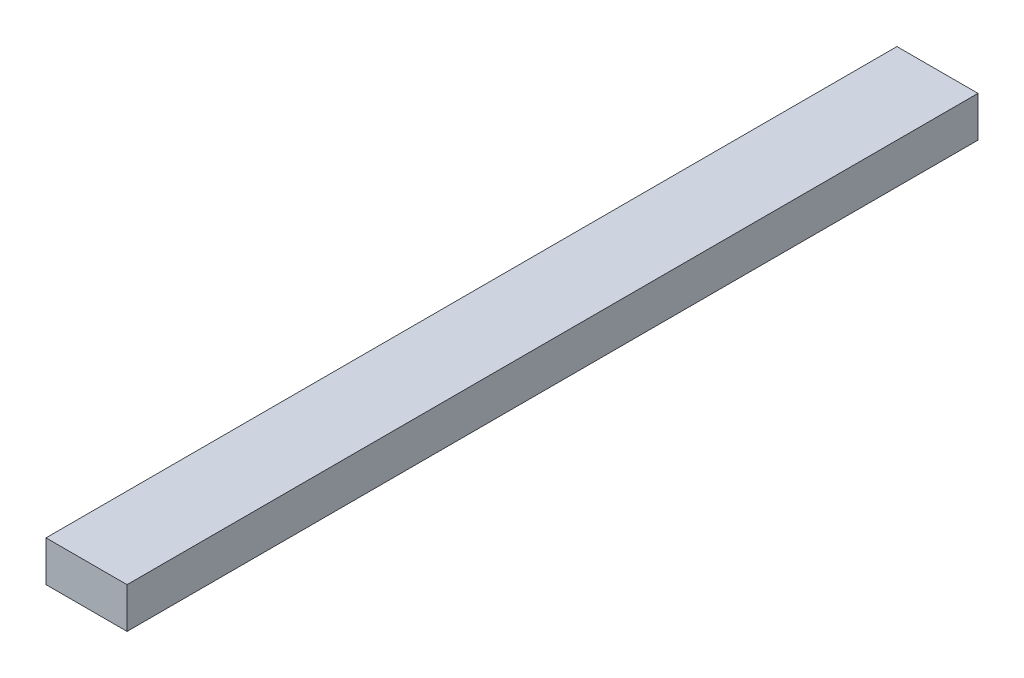
ISO-10303-21;
HEADER;
FILE_DESCRIPTION(('STEP AP214'),'2;1');
FILE_NAME('part.step','',(''),(''),'','','');
FILE_SCHEMA(('AUTOMOTIVE_DESIGN { 1 0 10303 214 1 1 1 1 }'));
ENDSEC;
DATA;
#1=APPLICATION_CONTEXT('core data for automotive mechanical design processes');
#2=APPLICATION_PROTOCOL_DEFINITION('international standard','automotive_design',2000,#1);
#3=PRODUCT_CONTEXT('',#1,'mechanical');
#4=PRODUCT('Part','Part','',(#3));
#5=PRODUCT_RELATED_PRODUCT_CATEGORY('part','',(#4));
#6=PRODUCT_DEFINITION_FORMATION('','',#4);
#7=PRODUCT_DEFINITION_CONTEXT('part definition',#1,'design');
#8=PRODUCT_DEFINITION('design','',#6,#7);
#9=PRODUCT_DEFINITION_SHAPE('','',#8);
#10=(LENGTH_UNIT() NAMED_UNIT(*) SI_UNIT(.MILLI.,.METRE.));
#11=(NAMED_UNIT(*) PLANE_ANGLE_UNIT() SI_UNIT($,.RADIAN.));
#12=(NAMED_UNIT(*) SI_UNIT($,.STERADIAN.) SOLID_ANGLE_UNIT());
#13=UNCERTAINTY_MEASURE_WITH_UNIT(LENGTH_MEASURE(1.E-05),#10,'distance_accuracy_value','');
#14=(GEOMETRIC_REPRESENTATION_CONTEXT(3) GLOBAL_UNCERTAINTY_ASSIGNED_CONTEXT((#13)) GLOBAL_UNIT_ASSIGNED_CONTEXT((#10,
#11,#12)) REPRESENTATION_CONTEXT('',''));
#15=CARTESIAN_POINT('',(0.,0.,0.));
#16=DIRECTION('',(0.,0.,1.));
#17=DIRECTION('',(1.,0.,0.));
#18=AXIS2_PLACEMENT_3D('',#15,#16,#17);
#19=CARTESIAN_POINT('',(19.05,-9.525,400.));
#20=DIRECTION('',(-1.,0.,0.));
#21=DIRECTION('',(0.,0.,1.));
#22=AXIS2_PLACEMENT_3D('',#19,#20,#21);
#23=PLANE('',#22);
#24=DIRECTION('',(0.,1.,0.));
#25=VECTOR('',#24,1.);
#26=CARTESIAN_POINT('',(19.05,-9.525,0.));
#27=LINE('',#26,#25);
#28=CARTESIAN_POINT('',(19.05,-9.525,0.));
#29=VERTEX_POINT('',#28);
#30=CARTESIAN_POINT('',(19.05,9.525,0.));
#31=VERTEX_POINT('',#30);
#32=EDGE_CURVE('E96',#29,#31,#27,.T.);
#33=ORIENTED_EDGE('',*,*,#32,.T.);
#34=DIRECTION('',(0.,0.,-1.));
#35=VECTOR('',#34,1.);
#36=CARTESIAN_POINT('',(19.05,9.525,400.));
#37=LINE('',#36,#35);
#38=CARTESIAN_POINT('',(19.05,9.525,400.));
#39=VERTEX_POINT('',#38);
#40=EDGE_CURVE('E11',#39,#31,#37,.T.);
#41=ORIENTED_EDGE('',*,*,#40,.F.);
#42=DIRECTION('',(0.,1.,0.));
#43=VECTOR('',#42,1.);
#44=CARTESIAN_POINT('',(19.05,-9.525,400.));
#45=LINE('',#44,#43);
#46=CARTESIAN_POINT('',(19.05,-9.525,400.));
#47=VERTEX_POINT('',#46);
#48=EDGE_CURVE('E84',#47,#39,#45,.T.);
#49=ORIENTED_EDGE('',*,*,#48,.F.);
#50=DIRECTION('',(0.,0.,-1.));
#51=VECTOR('',#50,1.);
#52=CARTESIAN_POINT('',(19.05,-9.525,400.));
#53=LINE('',#52,#51);
#54=EDGE_CURVE('E92',#47,#29,#53,.T.);
#55=ORIENTED_EDGE('',*,*,#54,.T.);
#56=EDGE_LOOP('',(#33,#41,#49,#55));
#57=FACE_BOUND('',#56,.T.);
#58=ADVANCED_FACE('F33',(#57),#23,.F.);
#59=CARTESIAN_POINT('',(-19.05,9.525,400.));
#60=DIRECTION('',(0.,-1.,0.));
#61=DIRECTION('',(0.,0.,-1.));
#62=AXIS2_PLACEMENT_3D('',#59,#60,#61);
#63=PLANE('',#62);
#64=DIRECTION('',(-1.,0.,0.));
#65=VECTOR('',#64,1.);
#66=CARTESIAN_POINT('',(-19.05,9.525,0.));
#67=LINE('',#66,#65);
#68=CARTESIAN_POINT('',(-19.05,9.525,0.));
#69=VERTEX_POINT('',#68);
#70=EDGE_CURVE('E88',#31,#69,#67,.T.);
#71=ORIENTED_EDGE('',*,*,#70,.T.);
#72=DIRECTION('',(0.,0.,-1.));
#73=VECTOR('',#72,1.);
#74=CARTESIAN_POINT('',(-19.05,9.525,400.));
#75=LINE('',#74,#73);
#76=CARTESIAN_POINT('',(-19.05,9.525,400.));
#77=VERTEX_POINT('',#76);
#78=EDGE_CURVE('E41',#77,#69,#75,.T.);
#79=ORIENTED_EDGE('',*,*,#78,.F.);
#80=DIRECTION('',(-1.,0.,0.));
#81=VECTOR('',#80,1.);
#82=CARTESIAN_POINT('',(-19.05,9.525,400.));
#83=LINE('',#82,#81);
#84=EDGE_CURVE('E79',#39,#77,#83,.T.);
#85=ORIENTED_EDGE('',*,*,#84,.F.);
#86=ORIENTED_EDGE('',*,*,#40,.T.);
#87=EDGE_LOOP('',(#71,#79,#85,#86));
#88=FACE_BOUND('',#87,.T.);
#89=ADVANCED_FACE('F87',(#88),#63,.F.);
#90=CARTESIAN_POINT('',(-19.05,-9.525,400.));
#91=DIRECTION('',(1.,0.,0.));
#92=DIRECTION('',(0.,0.,-1.));
#93=AXIS2_PLACEMENT_3D('',#90,#91,#92);
#94=PLANE('',#93);
#95=DIRECTION('',(0.,-1.,0.));
#96=VECTOR('',#95,1.);
#97=CARTESIAN_POINT('',(-19.05,-9.525,0.));
#98=LINE('',#97,#96);
#99=CARTESIAN_POINT('',(-19.05,-9.525,0.));
#100=VERTEX_POINT('',#99);
#101=EDGE_CURVE('E66',#69,#100,#98,.T.);
#102=ORIENTED_EDGE('',*,*,#101,.T.);
#103=DIRECTION('',(0.,0.,-1.));
#104=VECTOR('',#103,1.);
#105=CARTESIAN_POINT('',(-19.05,-9.525,400.));
#106=LINE('',#105,#104);
#107=CARTESIAN_POINT('',(-19.05,-9.525,400.));
#108=VERTEX_POINT('',#107);
#109=EDGE_CURVE('E89',#108,#100,#106,.T.);
#110=ORIENTED_EDGE('',*,*,#109,.F.);
#111=DIRECTION('',(0.,-1.,0.));
#112=VECTOR('',#111,1.);
#113=CARTESIAN_POINT('',(-19.05,-9.525,400.));
#114=LINE('',#113,#112);
#115=EDGE_CURVE('E82',#77,#108,#114,.T.);
#116=ORIENTED_EDGE('',*,*,#115,.F.);
#117=ORIENTED_EDGE('',*,*,#78,.T.);
#118=EDGE_LOOP('',(#102,#110,#116,#117));
#119=FACE_BOUND('',#118,.T.);
#120=ADVANCED_FACE('F90',(#119),#94,.F.);
#121=CARTESIAN_POINT('',(-19.05,-9.525,400.));
#122=DIRECTION('',(0.,1.,0.));
#123=DIRECTION('',(0.,0.,1.));
#124=AXIS2_PLACEMENT_3D('',#121,#122,#123);
#125=PLANE('',#124);
#126=DIRECTION('',(1.,0.,0.));
#127=VECTOR('',#126,1.);
#128=CARTESIAN_POINT('',(-19.05,-9.525,0.));
#129=LINE('',#128,#127);
#130=EDGE_CURVE('E72',#100,#29,#129,.T.);
#131=ORIENTED_EDGE('',*,*,#130,.T.);
#132=ORIENTED_EDGE('',*,*,#54,.F.);
#133=DIRECTION('',(1.,0.,0.));
#134=VECTOR('',#133,1.);
#135=CARTESIAN_POINT('',(-19.05,-9.525,400.));
#136=LINE('',#135,#134);
#137=EDGE_CURVE('E49',#108,#47,#136,.T.);
#138=ORIENTED_EDGE('',*,*,#137,.F.);
#139=ORIENTED_EDGE('',*,*,#109,.T.);
#140=EDGE_LOOP('',(#131,#132,#138,#139));
#141=FACE_BOUND('',#140,.T.);
#142=ADVANCED_FACE('F103',(#141),#125,.F.);
#143=CARTESIAN_POINT('',(0.,0.,400.));
#144=DIRECTION('',(0.,0.,-1.));
#145=DIRECTION('',(-1.,0.,0.));
#146=AXIS2_PLACEMENT_3D('',#143,#144,#145);
#147=PLANE('',#146);
#148=ORIENTED_EDGE('',*,*,#48,.T.);
#149=ORIENTED_EDGE('',*,*,#84,.T.);
#150=ORIENTED_EDGE('',*,*,#115,.T.);
#151=ORIENTED_EDGE('',*,*,#137,.T.);
#152=EDGE_LOOP('',(#148,#149,#150,#151));
#153=FACE_BOUND('',#152,.T.);
#154=ADVANCED_FACE('F80',(#153),#147,.F.);
#155=CARTESIAN_POINT('',(0.,0.,0.));
#156=DIRECTION('',(0.,0.,-1.));
#157=DIRECTION('',(-1.,0.,0.));
#158=AXIS2_PLACEMENT_3D('',#155,#156,#157);
#159=PLANE('',#158);
#160=ORIENTED_EDGE('',*,*,#32,.F.);
#161=ORIENTED_EDGE('',*,*,#130,.F.);
#162=ORIENTED_EDGE('',*,*,#101,.F.);
#163=ORIENTED_EDGE('',*,*,#70,.F.);
#164=EDGE_LOOP('',(#160,#161,#162,#163));
#165=FACE_BOUND('',#164,.T.);
#166=ADVANCED_FACE('F106',(#165),#159,.T.);
#167=CLOSED_SHELL('',(#58,#89,#120,#142,#154,#166));
#168=MANIFOLD_SOLID_BREP('B2',#167);
#169=ADVANCED_BREP_SHAPE_REPRESENTATION('',(#18,#168),#14);
#170=SHAPE_DEFINITION_REPRESENTATION(#9,#169);
ENDSEC;
END-ISO-10303-21;
